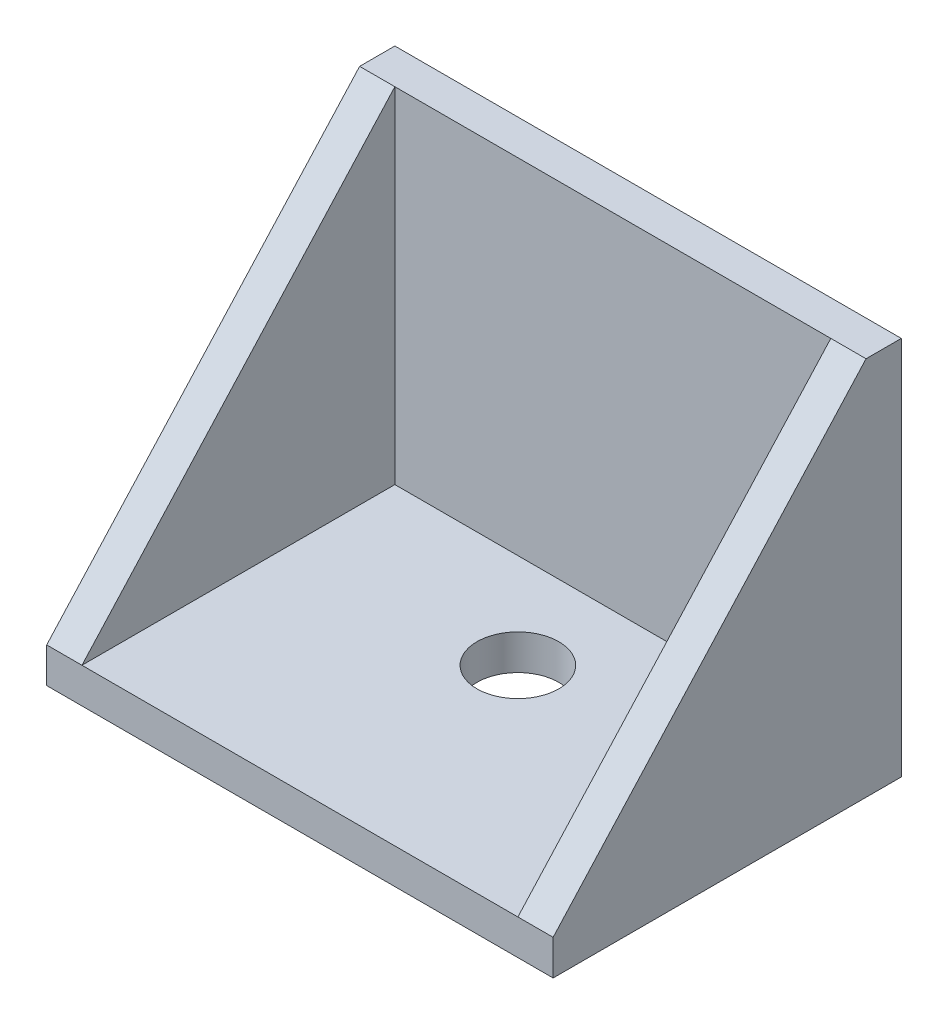
ISO-10303-21;
HEADER;
FILE_DESCRIPTION(('STEP AP214'),'2;1');
FILE_NAME('part.step','',(''),(''),'','','');
FILE_SCHEMA(('AUTOMOTIVE_DESIGN { 1 0 10303 214 1 1 1 1 }'));
ENDSEC;
DATA;
#1=APPLICATION_CONTEXT('core data for automotive mechanical design processes');
#2=APPLICATION_PROTOCOL_DEFINITION('international standard','automotive_design',2000,#1);
#3=PRODUCT_CONTEXT('',#1,'mechanical');
#4=PRODUCT('Part','Part','',(#3));
#5=PRODUCT_RELATED_PRODUCT_CATEGORY('part','',(#4));
#6=PRODUCT_DEFINITION_FORMATION('','',#4);
#7=PRODUCT_DEFINITION_CONTEXT('part definition',#1,'design');
#8=PRODUCT_DEFINITION('design','',#6,#7);
#9=PRODUCT_DEFINITION_SHAPE('','',#8);
#10=(LENGTH_UNIT() NAMED_UNIT(*) SI_UNIT(.MILLI.,.METRE.));
#11=(NAMED_UNIT(*) PLANE_ANGLE_UNIT() SI_UNIT($,.RADIAN.));
#12=(NAMED_UNIT(*) SI_UNIT($,.STERADIAN.) SOLID_ANGLE_UNIT());
#13=UNCERTAINTY_MEASURE_WITH_UNIT(LENGTH_MEASURE(1.E-05),#10,'distance_accuracy_value','');
#14=(GEOMETRIC_REPRESENTATION_CONTEXT(3) GLOBAL_UNCERTAINTY_ASSIGNED_CONTEXT((#13)) GLOBAL_UNIT_ASSIGNED_CONTEXT((#10,
#11,#12)) REPRESENTATION_CONTEXT('',''));
#15=CARTESIAN_POINT('',(0.,0.,0.));
#16=DIRECTION('',(0.,0.,1.));
#17=DIRECTION('',(1.,0.,0.));
#18=AXIS2_PLACEMENT_3D('',#15,#16,#17);
#19=CARTESIAN_POINT('',(0.,3.53568,0.));
#20=DIRECTION('',(0.,1.,0.));
#21=DIRECTION('',(0.,0.,1.));
#22=AXIS2_PLACEMENT_3D('',#19,#20,#21);
#23=PLANE('',#22);
#24=CARTESIAN_POINT('',(0.,3.53568,-4.40181999999999));
#25=DIRECTION('',(0.,1.,0.));
#26=DIRECTION('',(0.,0.,1.));
#27=AXIS2_PLACEMENT_3D('',#24,#25,#26);
#28=CIRCLE('',#27,4.1021);
#29=CARTESIAN_POINT('',(0.,3.53568,-0.299719999999992));
#30=VERTEX_POINT('',#29);
#31=EDGE_CURVE('E203',#30,#30,#28,.T.);
#32=ORIENTED_EDGE('',*,*,#31,.F.);
#33=EDGE_LOOP('',(#32));
#34=FACE_BOUND('',#33,.T.);
#35=DIRECTION('',(-1.,0.,0.));
#36=VECTOR('',#35,1.);
#37=CARTESIAN_POINT('',(0.,3.53568,-13.92682));
#38=LINE('',#37,#36);
#39=CARTESIAN_POINT('',(21.86432,3.53568,-13.92682));
#40=VERTEX_POINT('',#39);
#41=CARTESIAN_POINT('',(-21.86432,3.53568,-13.92682));
#42=VERTEX_POINT('',#41);
#43=EDGE_CURVE('E62',#40,#42,#38,.T.);
#44=ORIENTED_EDGE('',*,*,#43,.T.);
#45=DIRECTION('',(0.,0.,1.));
#46=VECTOR('',#45,1.);
#47=CARTESIAN_POINT('',(-21.86432,3.53568,0.));
#48=LINE('',#47,#46);
#49=CARTESIAN_POINT('',(-21.86432,3.53568,17.4625));
#50=VERTEX_POINT('',#49);
#51=EDGE_CURVE('E156',#42,#50,#48,.T.);
#52=ORIENTED_EDGE('',*,*,#51,.T.);
#53=DIRECTION('',(1.,0.,0.));
#54=VECTOR('',#53,1.);
#55=CARTESIAN_POINT('',(25.4,3.53568,17.4625));
#56=LINE('',#55,#54);
#57=CARTESIAN_POINT('',(21.86432,3.53568,17.4625));
#58=VERTEX_POINT('',#57);
#59=EDGE_CURVE('E126',#50,#58,#56,.T.);
#60=ORIENTED_EDGE('',*,*,#59,.T.);
#61=DIRECTION('',(0.,0.,-1.));
#62=VECTOR('',#61,1.);
#63=CARTESIAN_POINT('',(21.86432,3.53568,0.));
#64=LINE('',#63,#62);
#65=EDGE_CURVE('E163',#58,#40,#64,.T.);
#66=ORIENTED_EDGE('',*,*,#65,.T.);
#67=EDGE_LOOP('',(#44,#52,#60,#66));
#68=FACE_BOUND('',#67,.T.);
#69=ADVANCED_FACE('F39',(#34,#68),#23,.T.);
#70=CARTESIAN_POINT('',(-25.4,3.53568,17.4625));
#71=DIRECTION('',(1.,0.,0.));
#72=DIRECTION('',(0.,0.,-1.));
#73=AXIS2_PLACEMENT_3D('',#70,#71,#72);
#74=PLANE('',#73);
#75=DIRECTION('',(0.,-1.,0.));
#76=VECTOR('',#75,1.);
#77=CARTESIAN_POINT('',(-25.4,3.53568,17.4625));
#78=LINE('',#77,#76);
#79=CARTESIAN_POINT('',(-25.4,3.53568,17.4625));
#80=VERTEX_POINT('',#79);
#81=CARTESIAN_POINT('',(-25.4,0.,17.4625));
#82=VERTEX_POINT('',#81);
#83=EDGE_CURVE('E48',#80,#82,#78,.T.);
#84=ORIENTED_EDGE('',*,*,#83,.F.);
#85=DIRECTION('',(0.,0.740289518718379,-0.672288203433401));
#86=VECTOR('',#85,1.);
#87=CARTESIAN_POINT('',(-25.4,3.53568,17.4625));
#88=LINE('',#87,#86);
#89=CARTESIAN_POINT('',(-25.4,38.1,-13.92682));
#90=VERTEX_POINT('',#89);
#91=EDGE_CURVE('E104',#80,#90,#88,.T.);
#92=ORIENTED_EDGE('',*,*,#91,.T.);
#93=DIRECTION('',(0.,0.,1.));
#94=VECTOR('',#93,1.);
#95=CARTESIAN_POINT('',(-25.4,38.1,0.));
#96=LINE('',#95,#94);
#97=CARTESIAN_POINT('',(-25.4,38.1,-17.4625));
#98=VERTEX_POINT('',#97);
#99=EDGE_CURVE('E178',#98,#90,#96,.T.);
#100=ORIENTED_EDGE('',*,*,#99,.F.);
#101=DIRECTION('',(0.,-1.,0.));
#102=VECTOR('',#101,1.);
#103=CARTESIAN_POINT('',(-25.4,3.53568,-17.4625));
#104=LINE('',#103,#102);
#105=CARTESIAN_POINT('',(-25.4,0.,-17.4625));
#106=VERTEX_POINT('',#105);
#107=EDGE_CURVE('E142',#98,#106,#104,.T.);
#108=ORIENTED_EDGE('',*,*,#107,.T.);
#109=DIRECTION('',(0.,0.,1.));
#110=VECTOR('',#109,1.);
#111=CARTESIAN_POINT('',(-25.4,0.,17.4625));
#112=LINE('',#111,#110);
#113=EDGE_CURVE('E132',#106,#82,#112,.T.);
#114=ORIENTED_EDGE('',*,*,#113,.T.);
#115=EDGE_LOOP('',(#84,#92,#100,#108,#114));
#116=FACE_BOUND('',#115,.T.);
#117=ADVANCED_FACE('F41',(#116),#74,.F.);
#118=CARTESIAN_POINT('',(25.4,3.53568,17.4625));
#119=DIRECTION('',(0.,0.,-1.));
#120=DIRECTION('',(-1.,0.,0.));
#121=AXIS2_PLACEMENT_3D('',#118,#119,#120);
#122=PLANE('',#121);
#123=DIRECTION('',(0.,-1.,0.));
#124=VECTOR('',#123,1.);
#125=CARTESIAN_POINT('',(25.4,3.53568,17.4625));
#126=LINE('',#125,#124);
#127=CARTESIAN_POINT('',(25.4,3.53568,17.4625));
#128=VERTEX_POINT('',#127);
#129=CARTESIAN_POINT('',(25.4,0.,17.4625));
#130=VERTEX_POINT('',#129);
#131=EDGE_CURVE('E134',#128,#130,#126,.T.);
#132=ORIENTED_EDGE('',*,*,#131,.F.);
#133=DIRECTION('',(1.,0.,0.));
#134=VECTOR('',#133,1.);
#135=CARTESIAN_POINT('',(-25.4,3.53568,17.4625));
#136=LINE('',#135,#134);
#137=EDGE_CURVE('E116',#58,#128,#136,.T.);
#138=ORIENTED_EDGE('',*,*,#137,.F.);
#139=ORIENTED_EDGE('',*,*,#59,.F.);
#140=EDGE_CURVE('E107',#80,#50,#136,.T.);
#141=ORIENTED_EDGE('',*,*,#140,.F.);
#142=ORIENTED_EDGE('',*,*,#83,.T.);
#143=DIRECTION('',(1.,0.,0.));
#144=VECTOR('',#143,1.);
#145=CARTESIAN_POINT('',(25.4,0.,17.4625));
#146=LINE('',#145,#144);
#147=EDGE_CURVE('E151',#82,#130,#146,.T.);
#148=ORIENTED_EDGE('',*,*,#147,.T.);
#149=EDGE_LOOP('',(#132,#138,#139,#141,#142,#148));
#150=FACE_BOUND('',#149,.T.);
#151=ADVANCED_FACE('F121',(#150),#122,.F.);
#152=CARTESIAN_POINT('',(25.4,3.53568,17.4625));
#153=DIRECTION('',(-1.,0.,0.));
#154=DIRECTION('',(0.,0.,1.));
#155=AXIS2_PLACEMENT_3D('',#152,#153,#154);
#156=PLANE('',#155);
#157=DIRECTION('',(0.,0.,-1.));
#158=VECTOR('',#157,1.);
#159=CARTESIAN_POINT('',(25.4,38.1,0.));
#160=LINE('',#159,#158);
#161=CARTESIAN_POINT('',(25.4,38.1,-13.92682));
#162=VERTEX_POINT('',#161);
#163=CARTESIAN_POINT('',(25.4,38.1,-17.4625));
#164=VERTEX_POINT('',#163);
#165=EDGE_CURVE('E185',#162,#164,#160,.T.);
#166=ORIENTED_EDGE('',*,*,#165,.F.);
#167=DIRECTION('',(0.,0.740289518718379,-0.672288203433401));
#168=VECTOR('',#167,1.);
#169=CARTESIAN_POINT('',(25.4,3.53568,17.4625));
#170=LINE('',#169,#168);
#171=EDGE_CURVE('E54',#128,#162,#170,.T.);
#172=ORIENTED_EDGE('',*,*,#171,.F.);
#173=ORIENTED_EDGE('',*,*,#131,.T.);
#174=DIRECTION('',(0.,0.,-1.));
#175=VECTOR('',#174,1.);
#176=CARTESIAN_POINT('',(25.4,0.,17.4625));
#177=LINE('',#176,#175);
#178=CARTESIAN_POINT('',(25.4,0.,-17.4625));
#179=VERTEX_POINT('',#178);
#180=EDGE_CURVE('E148',#130,#179,#177,.T.);
#181=ORIENTED_EDGE('',*,*,#180,.T.);
#182=DIRECTION('',(0.,-1.,0.));
#183=VECTOR('',#182,1.);
#184=CARTESIAN_POINT('',(25.4,3.53568,-17.4625));
#185=LINE('',#184,#183);
#186=EDGE_CURVE('E136',#164,#179,#185,.T.);
#187=ORIENTED_EDGE('',*,*,#186,.F.);
#188=EDGE_LOOP('',(#166,#172,#173,#181,#187));
#189=FACE_BOUND('',#188,.T.);
#190=ADVANCED_FACE('F226',(#189),#156,.F.);
#191=CARTESIAN_POINT('',(25.4,3.53568,-17.4625));
#192=DIRECTION('',(0.,0.,1.));
#193=DIRECTION('',(1.,0.,0.));
#194=AXIS2_PLACEMENT_3D('',#191,#192,#193);
#195=PLANE('',#194);
#196=DIRECTION('',(-1.,0.,0.));
#197=VECTOR('',#196,1.);
#198=CARTESIAN_POINT('',(25.4,0.,-17.4625));
#199=LINE('',#198,#197);
#200=EDGE_CURVE('E145',#179,#106,#199,.T.);
#201=ORIENTED_EDGE('',*,*,#200,.T.);
#202=ORIENTED_EDGE('',*,*,#107,.F.);
#203=DIRECTION('',(-1.,0.,0.));
#204=VECTOR('',#203,1.);
#205=CARTESIAN_POINT('',(0.,38.1,-17.4625));
#206=LINE('',#205,#204);
#207=EDGE_CURVE('E181',#164,#98,#206,.T.);
#208=ORIENTED_EDGE('',*,*,#207,.F.);
#209=ORIENTED_EDGE('',*,*,#186,.T.);
#210=EDGE_LOOP('',(#201,#202,#208,#209));
#211=FACE_BOUND('',#210,.T.);
#212=ADVANCED_FACE('F222',(#211),#195,.F.);
#213=CARTESIAN_POINT('',(0.,0.,0.));
#214=DIRECTION('',(0.,1.,0.));
#215=DIRECTION('',(0.,0.,1.));
#216=AXIS2_PLACEMENT_3D('',#213,#214,#215);
#217=PLANE('',#216);
#218=CARTESIAN_POINT('',(0.,0.,-4.40181999999999));
#219=DIRECTION('',(0.,1.,0.));
#220=DIRECTION('',(0.,0.,1.));
#221=AXIS2_PLACEMENT_3D('',#218,#219,#220);
#222=CIRCLE('',#221,4.1021);
#223=CARTESIAN_POINT('',(0.,0.,-0.299719999999992));
#224=VERTEX_POINT('',#223);
#225=EDGE_CURVE('E198',#224,#224,#222,.T.);
#226=ORIENTED_EDGE('',*,*,#225,.T.);
#227=EDGE_LOOP('',(#226));
#228=FACE_BOUND('',#227,.T.);
#229=ORIENTED_EDGE('',*,*,#180,.F.);
#230=ORIENTED_EDGE('',*,*,#147,.F.);
#231=ORIENTED_EDGE('',*,*,#113,.F.);
#232=ORIENTED_EDGE('',*,*,#200,.F.);
#233=EDGE_LOOP('',(#229,#230,#231,#232));
#234=FACE_BOUND('',#233,.T.);
#235=ADVANCED_FACE('F219',(#228,#234),#217,.F.);
#236=CARTESIAN_POINT('',(-21.86432,38.1,0.));
#237=DIRECTION('',(-1.,0.,0.));
#238=DIRECTION('',(0.,0.,1.));
#239=AXIS2_PLACEMENT_3D('',#236,#237,#238);
#240=PLANE('',#239);
#241=DIRECTION('',(0.,-1.,0.));
#242=VECTOR('',#241,1.);
#243=CARTESIAN_POINT('',(-21.86432,38.1,-13.92682));
#244=LINE('',#243,#242);
#245=CARTESIAN_POINT('',(-21.86432,38.1,-13.92682));
#246=VERTEX_POINT('',#245);
#247=EDGE_CURVE('E166',#246,#42,#244,.T.);
#248=ORIENTED_EDGE('',*,*,#247,.F.);
#249=DIRECTION('',(0.,-0.740289518718379,0.672288203433401));
#250=VECTOR('',#249,1.);
#251=CARTESIAN_POINT('',(-21.86432,31.1687900534582,-7.6322952704759));
#252=LINE('',#251,#250);
#253=EDGE_CURVE('E188',#246,#50,#252,.T.);
#254=ORIENTED_EDGE('',*,*,#253,.T.);
#255=ORIENTED_EDGE('',*,*,#51,.F.);
#256=EDGE_LOOP('',(#248,#254,#255));
#257=FACE_BOUND('',#256,.T.);
#258=ADVANCED_FACE('F217',(#257),#240,.F.);
#259=CARTESIAN_POINT('',(0.,38.1,-13.92682));
#260=DIRECTION('',(0.,0.,-1.));
#261=DIRECTION('',(-1.,0.,0.));
#262=AXIS2_PLACEMENT_3D('',#259,#260,#261);
#263=PLANE('',#262);
#264=ORIENTED_EDGE('',*,*,#43,.F.);
#265=DIRECTION('',(0.,-1.,0.));
#266=VECTOR('',#265,1.);
#267=CARTESIAN_POINT('',(21.86432,38.1,-13.92682));
#268=LINE('',#267,#266);
#269=CARTESIAN_POINT('',(21.86432,38.1,-13.92682));
#270=VERTEX_POINT('',#269);
#271=EDGE_CURVE('E170',#270,#40,#268,.T.);
#272=ORIENTED_EDGE('',*,*,#271,.F.);
#273=DIRECTION('',(1.,0.,0.));
#274=VECTOR('',#273,1.);
#275=CARTESIAN_POINT('',(0.,38.1,-13.92682));
#276=LINE('',#275,#274);
#277=EDGE_CURVE('E174',#246,#270,#276,.T.);
#278=ORIENTED_EDGE('',*,*,#277,.F.);
#279=ORIENTED_EDGE('',*,*,#247,.T.);
#280=EDGE_LOOP('',(#264,#272,#278,#279));
#281=FACE_BOUND('',#280,.T.);
#282=ADVANCED_FACE('F254',(#281),#263,.F.);
#283=CARTESIAN_POINT('',(21.86432,38.1,0.));
#284=DIRECTION('',(1.,0.,0.));
#285=DIRECTION('',(0.,0.,-1.));
#286=AXIS2_PLACEMENT_3D('',#283,#284,#285);
#287=PLANE('',#286);
#288=ORIENTED_EDGE('',*,*,#65,.F.);
#289=DIRECTION('',(0.,0.740289518718379,-0.672288203433401));
#290=VECTOR('',#289,1.);
#291=CARTESIAN_POINT('',(21.86432,31.1687900534582,-7.6322952704759));
#292=LINE('',#291,#290);
#293=EDGE_CURVE('E191',#58,#270,#292,.T.);
#294=ORIENTED_EDGE('',*,*,#293,.T.);
#295=ORIENTED_EDGE('',*,*,#271,.T.);
#296=EDGE_LOOP('',(#288,#294,#295));
#297=FACE_BOUND('',#296,.T.);
#298=ADVANCED_FACE('F261',(#297),#287,.F.);
#299=CARTESIAN_POINT('',(0.,38.1,0.));
#300=DIRECTION('',(0.,1.,0.));
#301=DIRECTION('',(0.,0.,1.));
#302=AXIS2_PLACEMENT_3D('',#299,#300,#301);
#303=PLANE('',#302);
#304=DIRECTION('',(-1.,0.,0.));
#305=VECTOR('',#304,1.);
#306=CARTESIAN_POINT('',(0.,38.1,-13.92682));
#307=LINE('',#306,#305);
#308=EDGE_CURVE('E11',#162,#270,#307,.T.);
#309=ORIENTED_EDGE('',*,*,#308,.F.);
#310=ORIENTED_EDGE('',*,*,#165,.T.);
#311=ORIENTED_EDGE('',*,*,#207,.T.);
#312=ORIENTED_EDGE('',*,*,#99,.T.);
#313=DIRECTION('',(1.,0.,0.));
#314=VECTOR('',#313,1.);
#315=CARTESIAN_POINT('',(-25.4,38.1,-13.92682));
#316=LINE('',#315,#314);
#317=EDGE_CURVE('E110',#90,#246,#316,.T.);
#318=ORIENTED_EDGE('',*,*,#317,.T.);
#319=ORIENTED_EDGE('',*,*,#277,.T.);
#320=EDGE_LOOP('',(#309,#310,#311,#312,#318,#319));
#321=FACE_BOUND('',#320,.T.);
#322=ADVANCED_FACE('F268',(#321),#303,.T.);
#323=CARTESIAN_POINT('',(-25.4,3.53568,17.4625));
#324=DIRECTION('',(0.,-0.672288203433401,-0.740289518718379));
#325=DIRECTION('',(0.,0.740289518718379,-0.672288203433402));
#326=AXIS2_PLACEMENT_3D('',#323,#324,#325);
#327=PLANE('',#326);
#328=ORIENTED_EDGE('',*,*,#317,.F.);
#329=ORIENTED_EDGE('',*,*,#91,.F.);
#330=ORIENTED_EDGE('',*,*,#140,.T.);
#331=ORIENTED_EDGE('',*,*,#253,.F.);
#332=EDGE_LOOP('',(#328,#329,#330,#331));
#333=FACE_BOUND('',#332,.T.);
#334=ADVANCED_FACE('F106',(#333),#327,.F.);
#335=ORIENTED_EDGE('',*,*,#137,.T.);
#336=ORIENTED_EDGE('',*,*,#171,.T.);
#337=ORIENTED_EDGE('',*,*,#308,.T.);
#338=ORIENTED_EDGE('',*,*,#293,.F.);
#339=EDGE_LOOP('',(#335,#336,#337,#338));
#340=FACE_BOUND('',#339,.T.);
#341=ADVANCED_FACE('F283',(#340),#327,.F.);
#342=CARTESIAN_POINT('',(0.,3.53568,-4.40181999999999));
#343=DIRECTION('',(0.,1.,0.));
#344=DIRECTION('',(0.,0.,1.));
#345=AXIS2_PLACEMENT_3D('',#342,#343,#344);
#346=CYLINDRICAL_SURFACE('',#345,4.1021);
#347=ORIENTED_EDGE('',*,*,#225,.F.);
#348=EDGE_LOOP('',(#347));
#349=FACE_BOUND('',#348,.T.);
#350=ORIENTED_EDGE('',*,*,#31,.T.);
#351=EDGE_LOOP('',(#350));
#352=FACE_BOUND('',#351,.T.);
#353=ADVANCED_FACE('F208',(#349,#352),#346,.F.);
#354=CLOSED_SHELL('',(#69,#117,#151,#190,#212,#235,#258,#282,#298,#322,#334,#341,#353));
#355=MANIFOLD_SOLID_BREP('B2',#354);
#356=ADVANCED_BREP_SHAPE_REPRESENTATION('',(#18,#355),#14);
#357=SHAPE_DEFINITION_REPRESENTATION(#9,#356);
ENDSEC;
END-ISO-10303-21;
